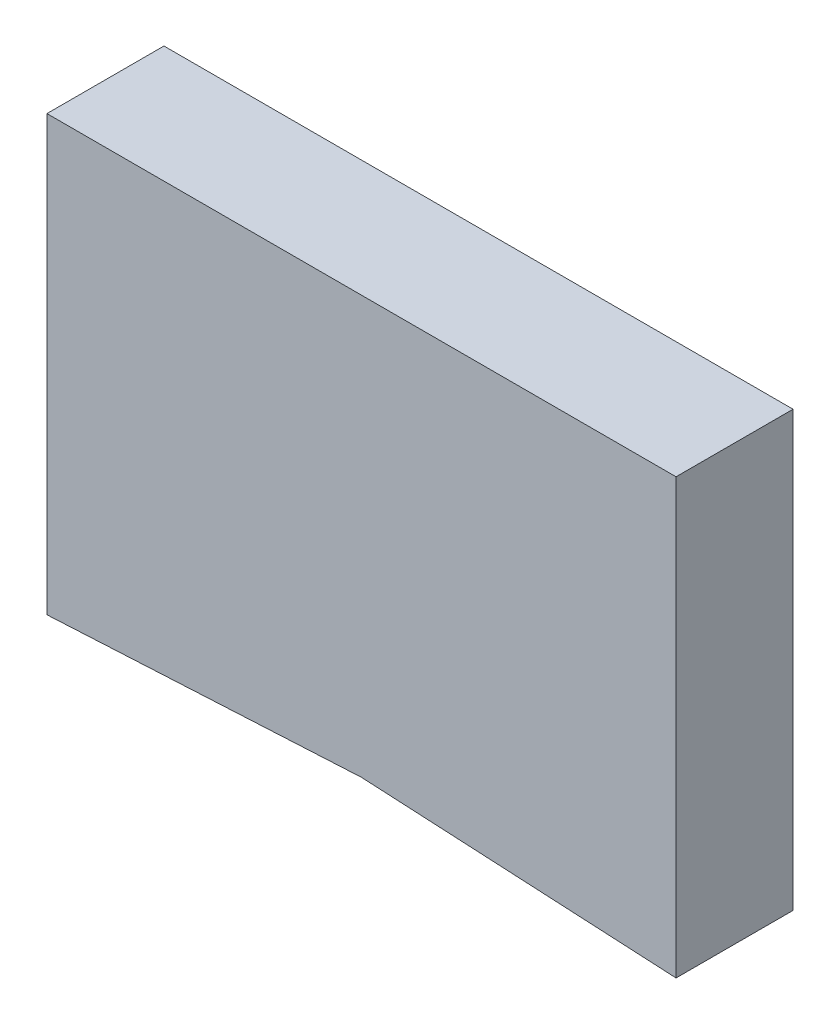
ISO-10303-21;
HEADER;
FILE_DESCRIPTION(('STEP AP214'),'2;1');
FILE_NAME('part.step','',(''),(''),'','','');
FILE_SCHEMA(('AUTOMOTIVE_DESIGN { 1 0 10303 214 1 1 1 1 }'));
ENDSEC;
DATA;
#1=APPLICATION_CONTEXT('core data for automotive mechanical design processes');
#2=APPLICATION_PROTOCOL_DEFINITION('international standard','automotive_design',2000,#1);
#3=PRODUCT_CONTEXT('',#1,'mechanical');
#4=PRODUCT('Part','Part','',(#3));
#5=PRODUCT_RELATED_PRODUCT_CATEGORY('part','',(#4));
#6=PRODUCT_DEFINITION_FORMATION('','',#4);
#7=PRODUCT_DEFINITION_CONTEXT('part definition',#1,'design');
#8=PRODUCT_DEFINITION('design','',#6,#7);
#9=PRODUCT_DEFINITION_SHAPE('','',#8);
#10=(LENGTH_UNIT() NAMED_UNIT(*) SI_UNIT(.MILLI.,.METRE.));
#11=(NAMED_UNIT(*) PLANE_ANGLE_UNIT() SI_UNIT($,.RADIAN.));
#12=(NAMED_UNIT(*) SI_UNIT($,.STERADIAN.) SOLID_ANGLE_UNIT());
#13=UNCERTAINTY_MEASURE_WITH_UNIT(LENGTH_MEASURE(1.E-05),#10,'distance_accuracy_value','');
#14=(GEOMETRIC_REPRESENTATION_CONTEXT(3) GLOBAL_UNCERTAINTY_ASSIGNED_CONTEXT((#13)) GLOBAL_UNIT_ASSIGNED_CONTEXT((#10,
#11,#12)) REPRESENTATION_CONTEXT('',''));
#15=CARTESIAN_POINT('',(0.,0.,0.));
#16=DIRECTION('',(0.,0.,1.));
#17=DIRECTION('',(1.,0.,0.));
#18=AXIS2_PLACEMENT_3D('',#15,#16,#17);
#19=CARTESIAN_POINT('',(40.,-55.2,7.44));
#20=DIRECTION('',(1.,0.,0.));
#21=DIRECTION('',(0.,0.,-1.));
#22=AXIS2_PLACEMENT_3D('',#19,#20,#21);
#23=PLANE('',#22);
#24=DIRECTION('',(0.,0.,-1.));
#25=VECTOR('',#24,1.);
#26=CARTESIAN_POINT('',(40.,0.,7.44));
#27=LINE('',#26,#25);
#28=CARTESIAN_POINT('',(40.,0.,7.44));
#29=VERTEX_POINT('',#28);
#30=CARTESIAN_POINT('',(40.,0.,-7.44));
#31=VERTEX_POINT('',#30);
#32=EDGE_CURVE('E108',#29,#31,#27,.T.);
#33=ORIENTED_EDGE('',*,*,#32,.F.);
#34=DIRECTION('',(0.,1.,0.));
#35=VECTOR('',#34,1.);
#36=CARTESIAN_POINT('',(40.,-55.2,7.44));
#37=LINE('',#36,#35);
#38=CARTESIAN_POINT('',(40.,-55.2,7.44));
#39=VERTEX_POINT('',#38);
#40=EDGE_CURVE('E11',#39,#29,#37,.T.);
#41=ORIENTED_EDGE('',*,*,#40,.F.);
#42=DIRECTION('',(0.,0.,-1.));
#43=VECTOR('',#42,1.);
#44=CARTESIAN_POINT('',(40.,-55.2,7.44));
#45=LINE('',#44,#43);
#46=CARTESIAN_POINT('',(40.,-55.2,-7.44));
#47=VERTEX_POINT('',#46);
#48=EDGE_CURVE('E96',#39,#47,#45,.T.);
#49=ORIENTED_EDGE('',*,*,#48,.T.);
#50=DIRECTION('',(0.,1.,0.));
#51=VECTOR('',#50,1.);
#52=CARTESIAN_POINT('',(40.,-55.2,-7.44));
#53=LINE('',#52,#51);
#54=EDGE_CURVE('E43',#47,#31,#53,.T.);
#55=ORIENTED_EDGE('',*,*,#54,.T.);
#56=EDGE_LOOP('',(#33,#41,#49,#55));
#57=FACE_BOUND('',#56,.T.);
#58=ADVANCED_FACE('F40',(#57),#23,.T.);
#59=CARTESIAN_POINT('',(-40.,-55.2,7.44));
#60=DIRECTION('',(0.,0.,1.));
#61=DIRECTION('',(1.,0.,0.));
#62=AXIS2_PLACEMENT_3D('',#59,#60,#61);
#63=PLANE('',#62);
#64=DIRECTION('',(0.998629534754574,-0.0523359562429371,0.));
#65=VECTOR('',#64,1.);
#66=CARTESIAN_POINT('',(0.,-53.1036888286786,7.44));
#67=LINE('',#66,#65);
#68=CARTESIAN_POINT('',(0.,-53.1036888286786,7.44));
#69=VERTEX_POINT('',#68);
#70=EDGE_CURVE('E111',#69,#39,#67,.T.);
#71=ORIENTED_EDGE('',*,*,#70,.T.);
#72=ORIENTED_EDGE('',*,*,#40,.T.);
#73=DIRECTION('',(1.,0.,0.));
#74=VECTOR('',#73,1.);
#75=CARTESIAN_POINT('',(-40.,0.,7.44));
#76=LINE('',#75,#74);
#77=CARTESIAN_POINT('',(-40.,0.,7.44));
#78=VERTEX_POINT('',#77);
#79=EDGE_CURVE('E88',#78,#29,#76,.T.);
#80=ORIENTED_EDGE('',*,*,#79,.F.);
#81=DIRECTION('',(0.,1.,0.));
#82=VECTOR('',#81,1.);
#83=CARTESIAN_POINT('',(-40.,-55.2,7.44));
#84=LINE('',#83,#82);
#85=CARTESIAN_POINT('',(-40.,-55.2,7.44));
#86=VERTEX_POINT('',#85);
#87=EDGE_CURVE('E49',#86,#78,#84,.T.);
#88=ORIENTED_EDGE('',*,*,#87,.F.);
#89=DIRECTION('',(0.998629534754574,0.0523359562429371,0.));
#90=VECTOR('',#89,1.);
#91=CARTESIAN_POINT('',(-40.,-55.2,7.44));
#92=LINE('',#91,#90);
#93=EDGE_CURVE('E57',#86,#69,#92,.T.);
#94=ORIENTED_EDGE('',*,*,#93,.T.);
#95=EDGE_LOOP('',(#71,#72,#80,#88,#94));
#96=FACE_BOUND('',#95,.T.);
#97=ADVANCED_FACE('F93',(#96),#63,.T.);
#98=CARTESIAN_POINT('',(-40.,-55.2,7.44));
#99=DIRECTION('',(-1.,0.,0.));
#100=DIRECTION('',(0.,0.,1.));
#101=AXIS2_PLACEMENT_3D('',#98,#99,#100);
#102=PLANE('',#101);
#103=DIRECTION('',(0.,0.,1.));
#104=VECTOR('',#103,1.);
#105=CARTESIAN_POINT('',(-40.,0.,7.44));
#106=LINE('',#105,#104);
#107=CARTESIAN_POINT('',(-40.,0.,-7.44));
#108=VERTEX_POINT('',#107);
#109=EDGE_CURVE('E77',#108,#78,#106,.T.);
#110=ORIENTED_EDGE('',*,*,#109,.F.);
#111=DIRECTION('',(0.,1.,0.));
#112=VECTOR('',#111,1.);
#113=CARTESIAN_POINT('',(-40.,-55.2,-7.44));
#114=LINE('',#113,#112);
#115=CARTESIAN_POINT('',(-40.,-55.2,-7.44));
#116=VERTEX_POINT('',#115);
#117=EDGE_CURVE('E82',#116,#108,#114,.T.);
#118=ORIENTED_EDGE('',*,*,#117,.F.);
#119=DIRECTION('',(0.,0.,1.));
#120=VECTOR('',#119,1.);
#121=CARTESIAN_POINT('',(-40.,-55.2,7.44));
#122=LINE('',#121,#120);
#123=EDGE_CURVE('E79',#116,#86,#122,.T.);
#124=ORIENTED_EDGE('',*,*,#123,.T.);
#125=ORIENTED_EDGE('',*,*,#87,.T.);
#126=EDGE_LOOP('',(#110,#118,#124,#125));
#127=FACE_BOUND('',#126,.T.);
#128=ADVANCED_FACE('F75',(#127),#102,.T.);
#129=CARTESIAN_POINT('',(-40.,-55.2,-7.44));
#130=DIRECTION('',(0.,0.,-1.));
#131=DIRECTION('',(-1.,0.,0.));
#132=AXIS2_PLACEMENT_3D('',#129,#130,#131);
#133=PLANE('',#132);
#134=DIRECTION('',(0.998629534754574,-0.0523359562429371,0.));
#135=VECTOR('',#134,1.);
#136=CARTESIAN_POINT('',(0.,-53.1036888286786,-7.44));
#137=LINE('',#136,#135);
#138=CARTESIAN_POINT('',(0.,-53.1036888286786,-7.44));
#139=VERTEX_POINT('',#138);
#140=EDGE_CURVE('E119',#139,#47,#137,.T.);
#141=ORIENTED_EDGE('',*,*,#140,.F.);
#142=DIRECTION('',(0.998629534754574,0.0523359562429371,0.));
#143=VECTOR('',#142,1.);
#144=CARTESIAN_POINT('',(-40.,-55.2,-7.44));
#145=LINE('',#144,#143);
#146=EDGE_CURVE('E121',#116,#139,#145,.T.);
#147=ORIENTED_EDGE('',*,*,#146,.F.);
#148=ORIENTED_EDGE('',*,*,#117,.T.);
#149=DIRECTION('',(-1.,0.,0.));
#150=VECTOR('',#149,1.);
#151=CARTESIAN_POINT('',(-40.,0.,-7.44));
#152=LINE('',#151,#150);
#153=EDGE_CURVE('E90',#31,#108,#152,.T.);
#154=ORIENTED_EDGE('',*,*,#153,.F.);
#155=ORIENTED_EDGE('',*,*,#54,.F.);
#156=EDGE_LOOP('',(#141,#147,#148,#154,#155));
#157=FACE_BOUND('',#156,.T.);
#158=ADVANCED_FACE('F131',(#157),#133,.T.);
#159=CARTESIAN_POINT('',(0.,0.,0.));
#160=DIRECTION('',(0.,-1.,0.));
#161=DIRECTION('',(0.,0.,-1.));
#162=AXIS2_PLACEMENT_3D('',#159,#160,#161);
#163=PLANE('',#162);
#164=ORIENTED_EDGE('',*,*,#32,.T.);
#165=ORIENTED_EDGE('',*,*,#153,.T.);
#166=ORIENTED_EDGE('',*,*,#109,.T.);
#167=ORIENTED_EDGE('',*,*,#79,.T.);
#168=EDGE_LOOP('',(#164,#165,#166,#167));
#169=FACE_BOUND('',#168,.T.);
#170=ADVANCED_FACE('F87',(#169),#163,.F.);
#171=CARTESIAN_POINT('',(0.,-53.1036888286786,7.44));
#172=DIRECTION('',(0.0523359562429371,0.998629534754574,0.));
#173=DIRECTION('',(-0.998629534754574,0.0523359562429371,0.));
#174=AXIS2_PLACEMENT_3D('',#171,#172,#173);
#175=PLANE('',#174);
#176=ORIENTED_EDGE('',*,*,#140,.T.);
#177=ORIENTED_EDGE('',*,*,#48,.F.);
#178=ORIENTED_EDGE('',*,*,#70,.F.);
#179=DIRECTION('',(0.,0.,-1.));
#180=VECTOR('',#179,1.);
#181=CARTESIAN_POINT('',(0.,-53.1036888286786,7.44));
#182=LINE('',#181,#180);
#183=EDGE_CURVE('E109',#69,#139,#182,.T.);
#184=ORIENTED_EDGE('',*,*,#183,.T.);
#185=EDGE_LOOP('',(#176,#177,#178,#184));
#186=FACE_BOUND('',#185,.T.);
#187=ADVANCED_FACE('F132',(#186),#175,.F.);
#188=CARTESIAN_POINT('',(-40.,-55.2,7.44));
#189=DIRECTION('',(-0.0523359562429371,0.998629534754574,0.));
#190=DIRECTION('',(-0.998629534754574,-0.0523359562429371,0.));
#191=AXIS2_PLACEMENT_3D('',#188,#189,#190);
#192=PLANE('',#191);
#193=ORIENTED_EDGE('',*,*,#146,.T.);
#194=ORIENTED_EDGE('',*,*,#183,.F.);
#195=ORIENTED_EDGE('',*,*,#93,.F.);
#196=ORIENTED_EDGE('',*,*,#123,.F.);
#197=EDGE_LOOP('',(#193,#194,#195,#196));
#198=FACE_BOUND('',#197,.T.);
#199=ADVANCED_FACE('F129',(#198),#192,.F.);
#200=CLOSED_SHELL('',(#58,#97,#128,#158,#170,#187,#199));
#201=MANIFOLD_SOLID_BREP('B2',#200);
#202=ADVANCED_BREP_SHAPE_REPRESENTATION('',(#18,#201),#14);
#203=SHAPE_DEFINITION_REPRESENTATION(#9,#202);
ENDSEC;
END-ISO-10303-21;
